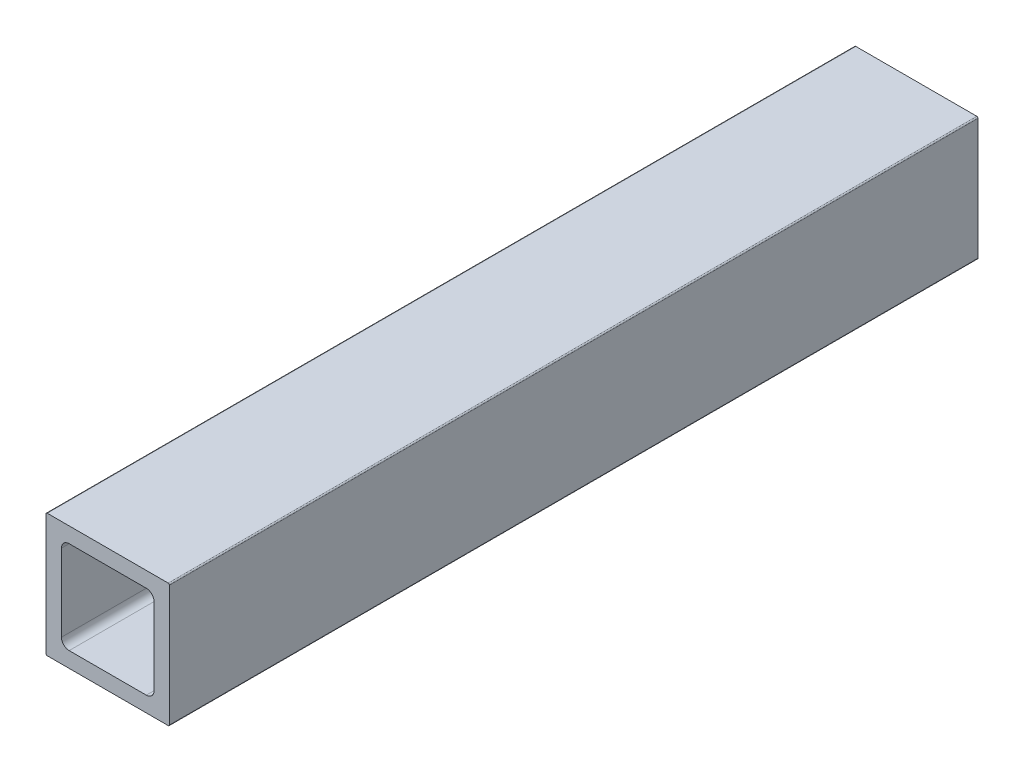
ISO-10303-21;
HEADER;
FILE_DESCRIPTION(('STEP AP214'),'2;1');
FILE_NAME('part.step','',(''),(''),'','','');
FILE_SCHEMA(('AUTOMOTIVE_DESIGN { 1 0 10303 214 1 1 1 1 }'));
ENDSEC;
DATA;
#1=APPLICATION_CONTEXT('core data for automotive mechanical design processes');
#2=APPLICATION_PROTOCOL_DEFINITION('international standard','automotive_design',2000,#1);
#3=PRODUCT_CONTEXT('',#1,'mechanical');
#4=PRODUCT('Part','Part','',(#3));
#5=PRODUCT_RELATED_PRODUCT_CATEGORY('part','',(#4));
#6=PRODUCT_DEFINITION_FORMATION('','',#4);
#7=PRODUCT_DEFINITION_CONTEXT('part definition',#1,'design');
#8=PRODUCT_DEFINITION('design','',#6,#7);
#9=PRODUCT_DEFINITION_SHAPE('','',#8);
#10=(LENGTH_UNIT() NAMED_UNIT(*) SI_UNIT(.MILLI.,.METRE.));
#11=(NAMED_UNIT(*) PLANE_ANGLE_UNIT() SI_UNIT($,.RADIAN.));
#12=(NAMED_UNIT(*) SI_UNIT($,.STERADIAN.) SOLID_ANGLE_UNIT());
#13=UNCERTAINTY_MEASURE_WITH_UNIT(LENGTH_MEASURE(1.E-05),#10,'distance_accuracy_value','');
#14=(GEOMETRIC_REPRESENTATION_CONTEXT(3) GLOBAL_UNCERTAINTY_ASSIGNED_CONTEXT((#13)) GLOBAL_UNIT_ASSIGNED_CONTEXT((#10,
#11,#12)) REPRESENTATION_CONTEXT('',''));
#15=CARTESIAN_POINT('',(0.,0.,0.));
#16=DIRECTION('',(0.,0.,1.));
#17=DIRECTION('',(1.,0.,0.));
#18=AXIS2_PLACEMENT_3D('',#15,#16,#17);
#19=CARTESIAN_POINT('',(0.254,0.254,0.));
#20=DIRECTION('',(0.,0.,-1.));
#21=DIRECTION('',(0.,-1.,0.));
#22=AXIS2_PLACEMENT_3D('',#19,#20,#21);
#23=PLANE('',#22);
#24=CARTESIAN_POINT('',(0.254,0.254,0.));
#25=DIRECTION('',(0.,0.,1.));
#26=DIRECTION('',(-1.,0.,0.));
#27=AXIS2_PLACEMENT_3D('',#24,#25,#26);
#28=CIRCLE('',#27,0.254);
#29=CARTESIAN_POINT('',(0.,0.254,0.));
#30=VERTEX_POINT('',#29);
#31=CARTESIAN_POINT('',(0.254,0.,0.));
#32=VERTEX_POINT('',#31);
#33=EDGE_CURVE('E193',#30,#32,#28,.T.);
#34=ORIENTED_EDGE('',*,*,#33,.F.);
#35=DIRECTION('',(0.,-1.,0.));
#36=VECTOR('',#35,1.);
#37=CARTESIAN_POINT('',(0.,0.254,0.));
#38=LINE('',#37,#36);
#39=CARTESIAN_POINT('',(0.,25.146,0.));
#40=VERTEX_POINT('',#39);
#41=EDGE_CURVE('E191',#40,#30,#38,.T.);
#42=ORIENTED_EDGE('',*,*,#41,.F.);
#43=CARTESIAN_POINT('',(0.254,25.146,0.));
#44=DIRECTION('',(0.,0.,1.));
#45=DIRECTION('',(-1.,0.,0.));
#46=AXIS2_PLACEMENT_3D('',#43,#44,#45);
#47=CIRCLE('',#46,0.254);
#48=CARTESIAN_POINT('',(0.254,25.4,0.));
#49=VERTEX_POINT('',#48);
#50=EDGE_CURVE('E213',#49,#40,#47,.T.);
#51=ORIENTED_EDGE('',*,*,#50,.F.);
#52=DIRECTION('',(-1.,0.,0.));
#53=VECTOR('',#52,1.);
#54=CARTESIAN_POINT('',(0.254,25.4,0.));
#55=LINE('',#54,#53);
#56=CARTESIAN_POINT('',(25.146,25.4,0.));
#57=VERTEX_POINT('',#56);
#58=EDGE_CURVE('E204',#57,#49,#55,.T.);
#59=ORIENTED_EDGE('',*,*,#58,.F.);
#60=CARTESIAN_POINT('',(25.146,25.146,0.));
#61=DIRECTION('',(0.,0.,1.));
#62=DIRECTION('',(-1.,0.,0.));
#63=AXIS2_PLACEMENT_3D('',#60,#61,#62);
#64=CIRCLE('',#63,0.254);
#65=CARTESIAN_POINT('',(25.4,25.146,0.));
#66=VERTEX_POINT('',#65);
#67=EDGE_CURVE('E236',#66,#57,#64,.T.);
#68=ORIENTED_EDGE('',*,*,#67,.F.);
#69=DIRECTION('',(0.,1.,0.));
#70=VECTOR('',#69,1.);
#71=CARTESIAN_POINT('',(25.4,0.254,0.));
#72=LINE('',#71,#70);
#73=CARTESIAN_POINT('',(25.4,0.254,0.));
#74=VERTEX_POINT('',#73);
#75=EDGE_CURVE('E235',#74,#66,#72,.T.);
#76=ORIENTED_EDGE('',*,*,#75,.F.);
#77=CARTESIAN_POINT('',(25.146,0.254,0.));
#78=DIRECTION('',(0.,0.,1.));
#79=DIRECTION('',(1.,0.,0.));
#80=AXIS2_PLACEMENT_3D('',#77,#78,#79);
#81=CIRCLE('',#80,0.254);
#82=CARTESIAN_POINT('',(25.146,0.,0.));
#83=VERTEX_POINT('',#82);
#84=EDGE_CURVE('E206',#83,#74,#81,.T.);
#85=ORIENTED_EDGE('',*,*,#84,.F.);
#86=DIRECTION('',(1.,0.,0.));
#87=VECTOR('',#86,1.);
#88=CARTESIAN_POINT('',(0.254,0.,0.));
#89=LINE('',#88,#87);
#90=EDGE_CURVE('E194',#32,#83,#89,.T.);
#91=ORIENTED_EDGE('',*,*,#90,.F.);
#92=EDGE_LOOP('',(#34,#42,#51,#59,#68,#76,#85,#91));
#93=FACE_BOUND('',#92,.T.);
#94=DIRECTION('',(0.,-1.,0.));
#95=VECTOR('',#94,1.);
#96=CARTESIAN_POINT('',(3.175,4.7625,0.));
#97=LINE('',#96,#95);
#98=CARTESIAN_POINT('',(3.175,20.6375,0.));
#99=VERTEX_POINT('',#98);
#100=CARTESIAN_POINT('',(3.175,4.7625,0.));
#101=VERTEX_POINT('',#100);
#102=EDGE_CURVE('E52',#99,#101,#97,.T.);
#103=ORIENTED_EDGE('',*,*,#102,.T.);
#104=CARTESIAN_POINT('',(4.7625,4.7625,0.));
#105=DIRECTION('',(0.,0.,1.));
#106=DIRECTION('',(1.,0.,0.));
#107=AXIS2_PLACEMENT_3D('',#104,#105,#106);
#108=CIRCLE('',#107,1.5875);
#109=CARTESIAN_POINT('',(4.7625,3.175,0.));
#110=VERTEX_POINT('',#109);
#111=EDGE_CURVE('E266',#101,#110,#108,.T.);
#112=ORIENTED_EDGE('',*,*,#111,.T.);
#113=DIRECTION('',(1.,0.,0.));
#114=VECTOR('',#113,1.);
#115=CARTESIAN_POINT('',(4.7625,3.175,0.));
#116=LINE('',#115,#114);
#117=CARTESIAN_POINT('',(20.6375,3.175,0.));
#118=VERTEX_POINT('',#117);
#119=EDGE_CURVE('E250',#110,#118,#116,.T.);
#120=ORIENTED_EDGE('',*,*,#119,.T.);
#121=CARTESIAN_POINT('',(20.6375,4.7625,0.));
#122=DIRECTION('',(0.,0.,1.));
#123=DIRECTION('',(-1.,0.,0.));
#124=AXIS2_PLACEMENT_3D('',#121,#122,#123);
#125=CIRCLE('',#124,1.5875);
#126=CARTESIAN_POINT('',(22.225,4.7625,0.));
#127=VERTEX_POINT('',#126);
#128=EDGE_CURVE('E223',#118,#127,#125,.T.);
#129=ORIENTED_EDGE('',*,*,#128,.T.);
#130=DIRECTION('',(0.,1.,0.));
#131=VECTOR('',#130,1.);
#132=CARTESIAN_POINT('',(22.225,4.7625,0.));
#133=LINE('',#132,#131);
#134=CARTESIAN_POINT('',(22.225,20.6375,0.));
#135=VERTEX_POINT('',#134);
#136=EDGE_CURVE('E219',#127,#135,#133,.T.);
#137=ORIENTED_EDGE('',*,*,#136,.T.);
#138=CARTESIAN_POINT('',(20.6375,20.6375,0.));
#139=DIRECTION('',(0.,0.,1.));
#140=DIRECTION('',(-1.,0.,0.));
#141=AXIS2_PLACEMENT_3D('',#138,#139,#140);
#142=CIRCLE('',#141,1.5875);
#143=CARTESIAN_POINT('',(20.6375,22.225,0.));
#144=VERTEX_POINT('',#143);
#145=EDGE_CURVE('E224',#135,#144,#142,.T.);
#146=ORIENTED_EDGE('',*,*,#145,.T.);
#147=DIRECTION('',(-1.,0.,0.));
#148=VECTOR('',#147,1.);
#149=CARTESIAN_POINT('',(4.7625,22.225,0.));
#150=LINE('',#149,#148);
#151=CARTESIAN_POINT('',(4.7625,22.225,0.));
#152=VERTEX_POINT('',#151);
#153=EDGE_CURVE('E229',#144,#152,#150,.T.);
#154=ORIENTED_EDGE('',*,*,#153,.T.);
#155=CARTESIAN_POINT('',(4.7625,20.6375,0.));
#156=DIRECTION('',(0.,0.,1.));
#157=DIRECTION('',(-1.,0.,0.));
#158=AXIS2_PLACEMENT_3D('',#155,#156,#157);
#159=CIRCLE('',#158,1.5875);
#160=EDGE_CURVE('E197',#152,#99,#159,.T.);
#161=ORIENTED_EDGE('',*,*,#160,.T.);
#162=EDGE_LOOP('',(#103,#112,#120,#129,#137,#146,#154,#161));
#163=FACE_BOUND('',#162,.T.);
#164=ADVANCED_FACE('F44',(#93,#163),#23,.T.);
#165=CARTESIAN_POINT('',(0.254,0.254,1828.8));
#166=DIRECTION('',(0.,0.,-1.));
#167=DIRECTION('',(-1.,0.,0.));
#168=AXIS2_PLACEMENT_3D('',#165,#166,#167);
#169=CYLINDRICAL_SURFACE('',#168,0.254);
#170=CARTESIAN_POINT('',(0.254,0.254,166.37));
#171=DIRECTION('',(0.,0.,-1.));
#172=DIRECTION('',(-1.,0.,0.));
#173=AXIS2_PLACEMENT_3D('',#170,#171,#172);
#174=CIRCLE('',#173,0.254);
#175=CARTESIAN_POINT('',(0.,0.254,166.37));
#176=VERTEX_POINT('',#175);
#177=CARTESIAN_POINT('',(0.254,0.,166.37));
#178=VERTEX_POINT('',#177);
#179=EDGE_CURVE('E172',#176,#178,#174,.F.);
#180=ORIENTED_EDGE('',*,*,#179,.F.);
#181=DIRECTION('',(0.,0.,-1.));
#182=VECTOR('',#181,1.);
#183=CARTESIAN_POINT('',(0.,0.254,1828.8));
#184=LINE('',#183,#182);
#185=EDGE_CURVE('E183',#176,#30,#184,.T.);
#186=ORIENTED_EDGE('',*,*,#185,.T.);
#187=ORIENTED_EDGE('',*,*,#33,.T.);
#188=DIRECTION('',(0.,0.,-1.));
#189=VECTOR('',#188,1.);
#190=CARTESIAN_POINT('',(0.254,0.,1828.8));
#191=LINE('',#190,#189);
#192=EDGE_CURVE('E185',#178,#32,#191,.T.);
#193=ORIENTED_EDGE('',*,*,#192,.F.);
#194=EDGE_LOOP('',(#180,#186,#187,#193));
#195=FACE_BOUND('',#194,.T.);
#196=ADVANCED_FACE('F181',(#195),#169,.T.);
#197=CARTESIAN_POINT('',(0.254,0.,1828.8));
#198=DIRECTION('',(0.,1.,0.));
#199=DIRECTION('',(1.,0.,0.));
#200=AXIS2_PLACEMENT_3D('',#197,#198,#199);
#201=PLANE('',#200);
#202=DIRECTION('',(0.,0.,-1.));
#203=VECTOR('',#202,1.);
#204=CARTESIAN_POINT('',(25.146,0.,1828.8));
#205=LINE('',#204,#203);
#206=CARTESIAN_POINT('',(25.146,0.,166.37));
#207=VERTEX_POINT('',#206);
#208=EDGE_CURVE('E210',#207,#83,#205,.T.);
#209=ORIENTED_EDGE('',*,*,#208,.F.);
#210=DIRECTION('',(1.,0.,0.));
#211=VECTOR('',#210,1.);
#212=CARTESIAN_POINT('',(0.,0.,166.37));
#213=LINE('',#212,#211);
#214=EDGE_CURVE('E177',#178,#207,#213,.T.);
#215=ORIENTED_EDGE('',*,*,#214,.F.);
#216=ORIENTED_EDGE('',*,*,#192,.T.);
#217=ORIENTED_EDGE('',*,*,#90,.T.);
#218=EDGE_LOOP('',(#209,#215,#216,#217));
#219=FACE_BOUND('',#218,.T.);
#220=ADVANCED_FACE('F289',(#219),#201,.F.);
#221=CARTESIAN_POINT('',(25.146,0.254,1828.8));
#222=DIRECTION('',(0.,0.,-1.));
#223=DIRECTION('',(-1.,0.,0.));
#224=AXIS2_PLACEMENT_3D('',#221,#222,#223);
#225=CYLINDRICAL_SURFACE('',#224,0.254);
#226=CARTESIAN_POINT('',(25.146,0.254,166.37));
#227=DIRECTION('',(0.,0.,-1.));
#228=DIRECTION('',(-1.,0.,0.));
#229=AXIS2_PLACEMENT_3D('',#226,#227,#228);
#230=CIRCLE('',#229,0.254);
#231=CARTESIAN_POINT('',(25.4,0.254,166.37));
#232=VERTEX_POINT('',#231);
#233=EDGE_CURVE('E187',#207,#232,#230,.F.);
#234=ORIENTED_EDGE('',*,*,#233,.F.);
#235=ORIENTED_EDGE('',*,*,#208,.T.);
#236=ORIENTED_EDGE('',*,*,#84,.T.);
#237=DIRECTION('',(0.,0.,-1.));
#238=VECTOR('',#237,1.);
#239=CARTESIAN_POINT('',(25.4,0.254,1828.8));
#240=LINE('',#239,#238);
#241=EDGE_CURVE('E233',#232,#74,#240,.T.);
#242=ORIENTED_EDGE('',*,*,#241,.F.);
#243=EDGE_LOOP('',(#234,#235,#236,#242));
#244=FACE_BOUND('',#243,.T.);
#245=ADVANCED_FACE('F283',(#244),#225,.T.);
#246=CARTESIAN_POINT('',(25.4,0.254,1828.8));
#247=DIRECTION('',(-1.,0.,0.));
#248=DIRECTION('',(0.,0.,1.));
#249=AXIS2_PLACEMENT_3D('',#246,#247,#248);
#250=PLANE('',#249);
#251=DIRECTION('',(0.,0.,-1.));
#252=VECTOR('',#251,1.);
#253=CARTESIAN_POINT('',(25.4,25.146,1828.8));
#254=LINE('',#253,#252);
#255=CARTESIAN_POINT('',(25.4,25.146,166.37));
#256=VERTEX_POINT('',#255);
#257=EDGE_CURVE('E258',#256,#66,#254,.T.);
#258=ORIENTED_EDGE('',*,*,#257,.F.);
#259=DIRECTION('',(0.,1.,0.));
#260=VECTOR('',#259,1.);
#261=CARTESIAN_POINT('',(25.4,0.,166.37));
#262=LINE('',#261,#260);
#263=EDGE_CURVE('E498',#232,#256,#262,.T.);
#264=ORIENTED_EDGE('',*,*,#263,.F.);
#265=ORIENTED_EDGE('',*,*,#241,.T.);
#266=ORIENTED_EDGE('',*,*,#75,.T.);
#267=EDGE_LOOP('',(#258,#264,#265,#266));
#268=FACE_BOUND('',#267,.T.);
#269=ADVANCED_FACE('F288',(#268),#250,.F.);
#270=CARTESIAN_POINT('',(25.146,25.146,1828.8));
#271=DIRECTION('',(0.,0.,-1.));
#272=DIRECTION('',(-1.,0.,0.));
#273=AXIS2_PLACEMENT_3D('',#270,#271,#272);
#274=CYLINDRICAL_SURFACE('',#273,0.254);
#275=CARTESIAN_POINT('',(25.146,25.146,166.37));
#276=DIRECTION('',(0.,0.,-1.));
#277=DIRECTION('',(-1.,0.,0.));
#278=AXIS2_PLACEMENT_3D('',#275,#276,#277);
#279=CIRCLE('',#278,0.254);
#280=CARTESIAN_POINT('',(25.146,25.4,166.37));
#281=VERTEX_POINT('',#280);
#282=EDGE_CURVE('E492',#256,#281,#279,.F.);
#283=ORIENTED_EDGE('',*,*,#282,.F.);
#284=ORIENTED_EDGE('',*,*,#257,.T.);
#285=ORIENTED_EDGE('',*,*,#67,.T.);
#286=DIRECTION('',(0.,0.,-1.));
#287=VECTOR('',#286,1.);
#288=CARTESIAN_POINT('',(25.146,25.4,1828.8));
#289=LINE('',#288,#287);
#290=EDGE_CURVE('E227',#281,#57,#289,.T.);
#291=ORIENTED_EDGE('',*,*,#290,.F.);
#292=EDGE_LOOP('',(#283,#284,#285,#291));
#293=FACE_BOUND('',#292,.T.);
#294=ADVANCED_FACE('F46',(#293),#274,.T.);
#295=CARTESIAN_POINT('',(0.254,25.4,1828.8));
#296=DIRECTION('',(0.,-1.,0.));
#297=DIRECTION('',(0.,0.,-1.));
#298=AXIS2_PLACEMENT_3D('',#295,#296,#297);
#299=PLANE('',#298);
#300=DIRECTION('',(0.,0.,-1.));
#301=VECTOR('',#300,1.);
#302=CARTESIAN_POINT('',(0.254,25.4,1828.8));
#303=LINE('',#302,#301);
#304=CARTESIAN_POINT('',(0.254,25.4,166.37));
#305=VERTEX_POINT('',#304);
#306=EDGE_CURVE('E211',#305,#49,#303,.T.);
#307=ORIENTED_EDGE('',*,*,#306,.F.);
#308=DIRECTION('',(-1.,0.,0.));
#309=VECTOR('',#308,1.);
#310=CARTESIAN_POINT('',(0.,25.4,166.37));
#311=LINE('',#310,#309);
#312=EDGE_CURVE('E545',#281,#305,#311,.T.);
#313=ORIENTED_EDGE('',*,*,#312,.F.);
#314=ORIENTED_EDGE('',*,*,#290,.T.);
#315=ORIENTED_EDGE('',*,*,#58,.T.);
#316=EDGE_LOOP('',(#307,#313,#314,#315));
#317=FACE_BOUND('',#316,.T.);
#318=ADVANCED_FACE('F347',(#317),#299,.F.);
#319=CARTESIAN_POINT('',(0.254,25.146,1828.8));
#320=DIRECTION('',(0.,0.,-1.));
#321=DIRECTION('',(-1.,0.,0.));
#322=AXIS2_PLACEMENT_3D('',#319,#320,#321);
#323=CYLINDRICAL_SURFACE('',#322,0.254);
#324=CARTESIAN_POINT('',(0.254,25.146,166.37));
#325=DIRECTION('',(0.,0.,-1.));
#326=DIRECTION('',(-1.,0.,0.));
#327=AXIS2_PLACEMENT_3D('',#324,#325,#326);
#328=CIRCLE('',#327,0.254);
#329=CARTESIAN_POINT('',(0.,25.146,166.37));
#330=VERTEX_POINT('',#329);
#331=EDGE_CURVE('E59',#305,#330,#328,.F.);
#332=ORIENTED_EDGE('',*,*,#331,.F.);
#333=ORIENTED_EDGE('',*,*,#306,.T.);
#334=ORIENTED_EDGE('',*,*,#50,.T.);
#335=DIRECTION('',(0.,0.,-1.));
#336=VECTOR('',#335,1.);
#337=CARTESIAN_POINT('',(0.,25.146,1828.8));
#338=LINE('',#337,#336);
#339=EDGE_CURVE('E216',#330,#40,#338,.T.);
#340=ORIENTED_EDGE('',*,*,#339,.F.);
#341=EDGE_LOOP('',(#332,#333,#334,#340));
#342=FACE_BOUND('',#341,.T.);
#343=ADVANCED_FACE('F276',(#342),#323,.T.);
#344=CARTESIAN_POINT('',(0.,0.254,1828.8));
#345=DIRECTION('',(1.,0.,0.));
#346=DIRECTION('',(0.,1.,0.));
#347=AXIS2_PLACEMENT_3D('',#344,#345,#346);
#348=PLANE('',#347);
#349=ORIENTED_EDGE('',*,*,#185,.F.);
#350=DIRECTION('',(0.,-1.,0.));
#351=VECTOR('',#350,1.);
#352=CARTESIAN_POINT('',(0.,0.,166.37));
#353=LINE('',#352,#351);
#354=EDGE_CURVE('E169',#330,#176,#353,.T.);
#355=ORIENTED_EDGE('',*,*,#354,.F.);
#356=ORIENTED_EDGE('',*,*,#339,.T.);
#357=ORIENTED_EDGE('',*,*,#41,.T.);
#358=EDGE_LOOP('',(#349,#355,#356,#357));
#359=FACE_BOUND('',#358,.T.);
#360=ADVANCED_FACE('F189',(#359),#348,.F.);
#361=CARTESIAN_POINT('',(4.7625,4.7625,1828.8));
#362=DIRECTION('',(0.,0.,-1.));
#363=DIRECTION('',(-1.,0.,0.));
#364=AXIS2_PLACEMENT_3D('',#361,#362,#363);
#365=CYLINDRICAL_SURFACE('',#364,1.5875);
#366=DIRECTION('',(0.,0.,-1.));
#367=VECTOR('',#366,1.);
#368=CARTESIAN_POINT('',(3.175,4.7625,1828.8));
#369=LINE('',#368,#367);
#370=CARTESIAN_POINT('',(3.175,4.7625,166.37));
#371=VERTEX_POINT('',#370);
#372=EDGE_CURVE('E186',#371,#101,#369,.T.);
#373=ORIENTED_EDGE('',*,*,#372,.F.);
#374=CARTESIAN_POINT('',(4.7625,4.7625,166.37));
#375=DIRECTION('',(0.,0.,-1.));
#376=DIRECTION('',(-1.,0.,0.));
#377=AXIS2_PLACEMENT_3D('',#374,#375,#376);
#378=CIRCLE('',#377,1.5875);
#379=CARTESIAN_POINT('',(4.7625,3.175,166.37));
#380=VERTEX_POINT('',#379);
#381=EDGE_CURVE('E66',#371,#380,#378,.F.);
#382=ORIENTED_EDGE('',*,*,#381,.T.);
#383=DIRECTION('',(0.,0.,-1.));
#384=VECTOR('',#383,1.);
#385=CARTESIAN_POINT('',(4.7625,3.175,1828.8));
#386=LINE('',#385,#384);
#387=EDGE_CURVE('E214',#380,#110,#386,.T.);
#388=ORIENTED_EDGE('',*,*,#387,.T.);
#389=ORIENTED_EDGE('',*,*,#111,.F.);
#390=EDGE_LOOP('',(#373,#382,#388,#389));
#391=FACE_BOUND('',#390,.T.);
#392=ADVANCED_FACE('F275',(#391),#365,.F.);
#393=CARTESIAN_POINT('',(4.7625,3.175,1828.8));
#394=DIRECTION('',(0.,1.,0.));
#395=DIRECTION('',(1.,0.,0.));
#396=AXIS2_PLACEMENT_3D('',#393,#394,#395);
#397=PLANE('',#396);
#398=DIRECTION('',(-1.,0.,0.));
#399=VECTOR('',#398,1.);
#400=CARTESIAN_POINT('',(4.7625,3.175,166.37));
#401=LINE('',#400,#399);
#402=CARTESIAN_POINT('',(20.6375,3.175,166.37));
#403=VERTEX_POINT('',#402);
#404=EDGE_CURVE('E532',#403,#380,#401,.T.);
#405=ORIENTED_EDGE('',*,*,#404,.F.);
#406=DIRECTION('',(0.,0.,-1.));
#407=VECTOR('',#406,1.);
#408=CARTESIAN_POINT('',(20.6375,3.175,1828.8));
#409=LINE('',#408,#407);
#410=EDGE_CURVE('E217',#403,#118,#409,.T.);
#411=ORIENTED_EDGE('',*,*,#410,.T.);
#412=ORIENTED_EDGE('',*,*,#119,.F.);
#413=ORIENTED_EDGE('',*,*,#387,.F.);
#414=EDGE_LOOP('',(#405,#411,#412,#413));
#415=FACE_BOUND('',#414,.T.);
#416=ADVANCED_FACE('F302',(#415),#397,.T.);
#417=CARTESIAN_POINT('',(20.6375,4.7625,1828.8));
#418=DIRECTION('',(0.,0.,-1.));
#419=DIRECTION('',(-1.,0.,0.));
#420=AXIS2_PLACEMENT_3D('',#417,#418,#419);
#421=CYLINDRICAL_SURFACE('',#420,1.5875);
#422=ORIENTED_EDGE('',*,*,#410,.F.);
#423=CARTESIAN_POINT('',(20.6375,4.7625,166.37));
#424=DIRECTION('',(0.,0.,-1.));
#425=DIRECTION('',(-1.,0.,0.));
#426=AXIS2_PLACEMENT_3D('',#423,#424,#425);
#427=CIRCLE('',#426,1.5875);
#428=CARTESIAN_POINT('',(22.225,4.7625,166.37));
#429=VERTEX_POINT('',#428);
#430=EDGE_CURVE('E513',#403,#429,#427,.F.);
#431=ORIENTED_EDGE('',*,*,#430,.T.);
#432=DIRECTION('',(0.,0.,-1.));
#433=VECTOR('',#432,1.);
#434=CARTESIAN_POINT('',(22.225,4.7625,1828.8));
#435=LINE('',#434,#433);
#436=EDGE_CURVE('E254',#429,#127,#435,.T.);
#437=ORIENTED_EDGE('',*,*,#436,.T.);
#438=ORIENTED_EDGE('',*,*,#128,.F.);
#439=EDGE_LOOP('',(#422,#431,#437,#438));
#440=FACE_BOUND('',#439,.T.);
#441=ADVANCED_FACE('F297',(#440),#421,.F.);
#442=CARTESIAN_POINT('',(22.225,4.7625,1828.8));
#443=DIRECTION('',(-1.,0.,0.));
#444=DIRECTION('',(0.,0.,1.));
#445=AXIS2_PLACEMENT_3D('',#442,#443,#444);
#446=PLANE('',#445);
#447=DIRECTION('',(0.,-1.,0.));
#448=VECTOR('',#447,1.);
#449=CARTESIAN_POINT('',(22.225,4.7625,166.37));
#450=LINE('',#449,#448);
#451=CARTESIAN_POINT('',(22.225,20.6375,166.37));
#452=VERTEX_POINT('',#451);
#453=EDGE_CURVE('E535',#452,#429,#450,.T.);
#454=ORIENTED_EDGE('',*,*,#453,.F.);
#455=DIRECTION('',(0.,0.,-1.));
#456=VECTOR('',#455,1.);
#457=CARTESIAN_POINT('',(22.225,20.6375,1828.8));
#458=LINE('',#457,#456);
#459=EDGE_CURVE('E240',#452,#135,#458,.T.);
#460=ORIENTED_EDGE('',*,*,#459,.T.);
#461=ORIENTED_EDGE('',*,*,#136,.F.);
#462=ORIENTED_EDGE('',*,*,#436,.F.);
#463=EDGE_LOOP('',(#454,#460,#461,#462));
#464=FACE_BOUND('',#463,.T.);
#465=ADVANCED_FACE('F301',(#464),#446,.T.);
#466=CARTESIAN_POINT('',(20.6375,20.6375,1828.8));
#467=DIRECTION('',(0.,0.,-1.));
#468=DIRECTION('',(-1.,0.,0.));
#469=AXIS2_PLACEMENT_3D('',#466,#467,#468);
#470=CYLINDRICAL_SURFACE('',#469,1.5875);
#471=ORIENTED_EDGE('',*,*,#459,.F.);
#472=CARTESIAN_POINT('',(20.6375,20.6375,166.37));
#473=DIRECTION('',(0.,0.,-1.));
#474=DIRECTION('',(-1.,0.,0.));
#475=AXIS2_PLACEMENT_3D('',#472,#473,#474);
#476=CIRCLE('',#475,1.5875);
#477=CARTESIAN_POINT('',(20.6375,22.225,166.37));
#478=VERTEX_POINT('',#477);
#479=EDGE_CURVE('E537',#452,#478,#476,.F.);
#480=ORIENTED_EDGE('',*,*,#479,.T.);
#481=DIRECTION('',(0.,0.,-1.));
#482=VECTOR('',#481,1.);
#483=CARTESIAN_POINT('',(20.6375,22.225,1828.8));
#484=LINE('',#483,#482);
#485=EDGE_CURVE('E238',#478,#144,#484,.T.);
#486=ORIENTED_EDGE('',*,*,#485,.T.);
#487=ORIENTED_EDGE('',*,*,#145,.F.);
#488=EDGE_LOOP('',(#471,#480,#486,#487));
#489=FACE_BOUND('',#488,.T.);
#490=ADVANCED_FACE('F309',(#489),#470,.F.);
#491=CARTESIAN_POINT('',(4.7625,22.225,1828.8));
#492=DIRECTION('',(0.,-1.,0.));
#493=DIRECTION('',(0.,0.,-1.));
#494=AXIS2_PLACEMENT_3D('',#491,#492,#493);
#495=PLANE('',#494);
#496=DIRECTION('',(1.,0.,0.));
#497=VECTOR('',#496,1.);
#498=CARTESIAN_POINT('',(4.7625,22.225,166.37));
#499=LINE('',#498,#497);
#500=CARTESIAN_POINT('',(4.7625,22.225,166.37));
#501=VERTEX_POINT('',#500);
#502=EDGE_CURVE('E540',#501,#478,#499,.T.);
#503=ORIENTED_EDGE('',*,*,#502,.F.);
#504=DIRECTION('',(0.,0.,-1.));
#505=VECTOR('',#504,1.);
#506=CARTESIAN_POINT('',(4.7625,22.225,1828.8));
#507=LINE('',#506,#505);
#508=EDGE_CURVE('E241',#501,#152,#507,.T.);
#509=ORIENTED_EDGE('',*,*,#508,.T.);
#510=ORIENTED_EDGE('',*,*,#153,.F.);
#511=ORIENTED_EDGE('',*,*,#485,.F.);
#512=EDGE_LOOP('',(#503,#509,#510,#511));
#513=FACE_BOUND('',#512,.T.);
#514=ADVANCED_FACE('F313',(#513),#495,.T.);
#515=CARTESIAN_POINT('',(4.7625,20.6375,1828.8));
#516=DIRECTION('',(0.,0.,-1.));
#517=DIRECTION('',(-1.,0.,0.));
#518=AXIS2_PLACEMENT_3D('',#515,#516,#517);
#519=CYLINDRICAL_SURFACE('',#518,1.5875);
#520=ORIENTED_EDGE('',*,*,#508,.F.);
#521=CARTESIAN_POINT('',(4.7625,20.6375,166.37));
#522=DIRECTION('',(0.,0.,-1.));
#523=DIRECTION('',(-1.,0.,0.));
#524=AXIS2_PLACEMENT_3D('',#521,#522,#523);
#525=CIRCLE('',#524,1.5875);
#526=CARTESIAN_POINT('',(3.175,20.6375,166.37));
#527=VERTEX_POINT('',#526);
#528=EDGE_CURVE('E542',#501,#527,#525,.F.);
#529=ORIENTED_EDGE('',*,*,#528,.T.);
#530=DIRECTION('',(0.,0.,-1.));
#531=VECTOR('',#530,1.);
#532=CARTESIAN_POINT('',(3.175,20.6375,1828.8));
#533=LINE('',#532,#531);
#534=EDGE_CURVE('E245',#527,#99,#533,.T.);
#535=ORIENTED_EDGE('',*,*,#534,.T.);
#536=ORIENTED_EDGE('',*,*,#160,.F.);
#537=EDGE_LOOP('',(#520,#529,#535,#536));
#538=FACE_BOUND('',#537,.T.);
#539=ADVANCED_FACE('F390',(#538),#519,.F.);
#540=CARTESIAN_POINT('',(3.175,4.7625,1828.8));
#541=DIRECTION('',(1.,0.,0.));
#542=DIRECTION('',(0.,1.,0.));
#543=AXIS2_PLACEMENT_3D('',#540,#541,#542);
#544=PLANE('',#543);
#545=DIRECTION('',(0.,1.,0.));
#546=VECTOR('',#545,1.);
#547=CARTESIAN_POINT('',(3.175,4.7625,166.37));
#548=LINE('',#547,#546);
#549=EDGE_CURVE('E11',#371,#527,#548,.T.);
#550=ORIENTED_EDGE('',*,*,#549,.F.);
#551=ORIENTED_EDGE('',*,*,#372,.T.);
#552=ORIENTED_EDGE('',*,*,#102,.F.);
#553=ORIENTED_EDGE('',*,*,#534,.F.);
#554=EDGE_LOOP('',(#550,#551,#552,#553));
#555=FACE_BOUND('',#554,.T.);
#556=ADVANCED_FACE('F394',(#555),#544,.T.);
#557=CARTESIAN_POINT('',(0.,0.,166.37));
#558=DIRECTION('',(0.,0.,-1.));
#559=DIRECTION('',(-1.,0.,0.));
#560=AXIS2_PLACEMENT_3D('',#557,#558,#559);
#561=PLANE('',#560);
#562=ORIENTED_EDGE('',*,*,#179,.T.);
#563=ORIENTED_EDGE('',*,*,#214,.T.);
#564=ORIENTED_EDGE('',*,*,#233,.T.);
#565=ORIENTED_EDGE('',*,*,#263,.T.);
#566=ORIENTED_EDGE('',*,*,#282,.T.);
#567=ORIENTED_EDGE('',*,*,#312,.T.);
#568=ORIENTED_EDGE('',*,*,#331,.T.);
#569=ORIENTED_EDGE('',*,*,#354,.T.);
#570=EDGE_LOOP('',(#562,#563,#564,#565,#566,#567,#568,#569));
#571=FACE_BOUND('',#570,.T.);
#572=ORIENTED_EDGE('',*,*,#549,.T.);
#573=ORIENTED_EDGE('',*,*,#528,.F.);
#574=ORIENTED_EDGE('',*,*,#502,.T.);
#575=ORIENTED_EDGE('',*,*,#479,.F.);
#576=ORIENTED_EDGE('',*,*,#453,.T.);
#577=ORIENTED_EDGE('',*,*,#430,.F.);
#578=ORIENTED_EDGE('',*,*,#404,.T.);
#579=ORIENTED_EDGE('',*,*,#381,.F.);
#580=EDGE_LOOP('',(#572,#573,#574,#575,#576,#577,#578,#579));
#581=FACE_BOUND('',#580,.T.);
#582=ADVANCED_FACE('F171',(#571,#581),#561,.F.);
#583=CLOSED_SHELL('',(#164,#196,#220,#245,#269,#294,#318,#343,#360,#392,#416,#441,#465,#490,
#514,#539,#556,#582));
#584=MANIFOLD_SOLID_BREP('B2',#583);
#585=ADVANCED_BREP_SHAPE_REPRESENTATION('',(#18,#584),#14);
#586=SHAPE_DEFINITION_REPRESENTATION(#9,#585);
ENDSEC;
END-ISO-10303-21;
